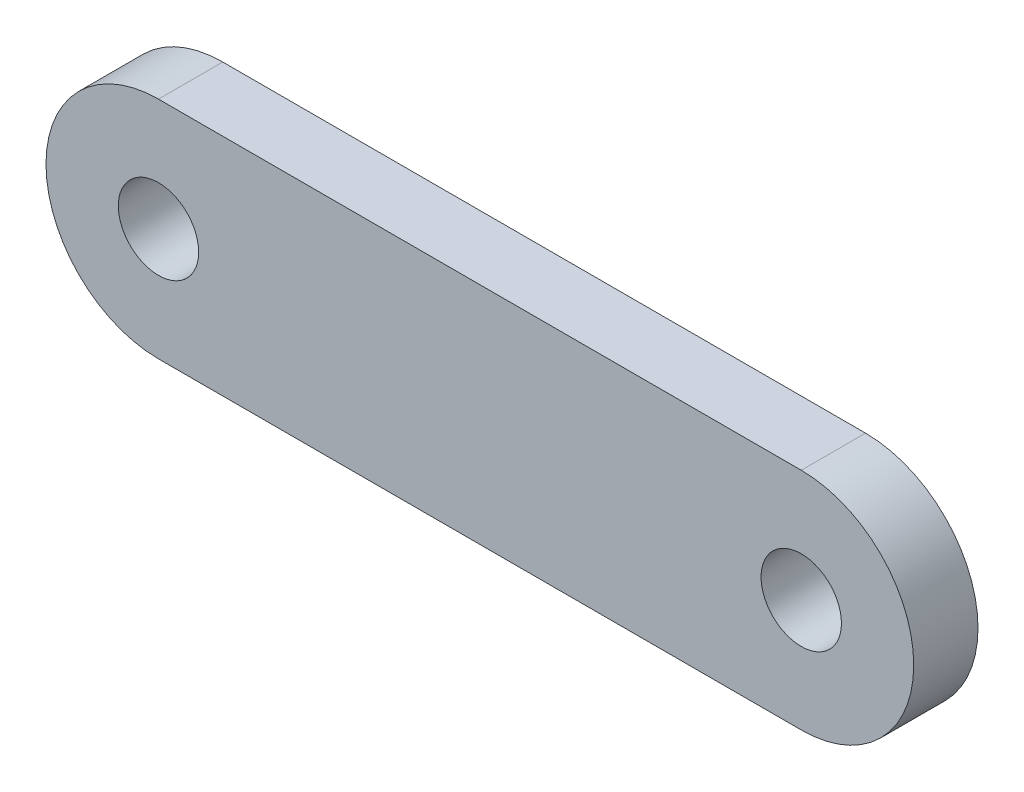
ISO-10303-21;
HEADER;
FILE_DESCRIPTION(('STEP AP214'),'2;1');
FILE_NAME('part.step','',(''),(''),'','','');
FILE_SCHEMA(('AUTOMOTIVE_DESIGN { 1 0 10303 214 1 1 1 1 }'));
ENDSEC;
DATA;
#1=APPLICATION_CONTEXT('core data for automotive mechanical design processes');
#2=APPLICATION_PROTOCOL_DEFINITION('international standard','automotive_design',2000,#1);
#3=PRODUCT_CONTEXT('',#1,'mechanical');
#4=PRODUCT('Part','Part','',(#3));
#5=PRODUCT_RELATED_PRODUCT_CATEGORY('part','',(#4));
#6=PRODUCT_DEFINITION_FORMATION('','',#4);
#7=PRODUCT_DEFINITION_CONTEXT('part definition',#1,'design');
#8=PRODUCT_DEFINITION('design','',#6,#7);
#9=PRODUCT_DEFINITION_SHAPE('','',#8);
#10=(LENGTH_UNIT() NAMED_UNIT(*) SI_UNIT(.MILLI.,.METRE.));
#11=(NAMED_UNIT(*) PLANE_ANGLE_UNIT() SI_UNIT($,.RADIAN.));
#12=(NAMED_UNIT(*) SI_UNIT($,.STERADIAN.) SOLID_ANGLE_UNIT());
#13=UNCERTAINTY_MEASURE_WITH_UNIT(LENGTH_MEASURE(1.E-05),#10,'distance_accuracy_value','');
#14=(GEOMETRIC_REPRESENTATION_CONTEXT(3) GLOBAL_UNCERTAINTY_ASSIGNED_CONTEXT((#13)) GLOBAL_UNIT_ASSIGNED_CONTEXT((#10,
#11,#12)) REPRESENTATION_CONTEXT('',''));
#15=CARTESIAN_POINT('',(0.,0.,0.));
#16=DIRECTION('',(0.,0.,1.));
#17=DIRECTION('',(1.,0.,0.));
#18=AXIS2_PLACEMENT_3D('',#15,#16,#17);
#19=CARTESIAN_POINT('',(0.,0.,4.));
#20=DIRECTION('',(0.,0.,1.));
#21=DIRECTION('',(1.,0.,0.));
#22=AXIS2_PLACEMENT_3D('',#19,#20,#21);
#23=PLANE('',#22);
#24=CARTESIAN_POINT('',(0.,0.,4.));
#25=DIRECTION('',(0.,0.,1.));
#26=DIRECTION('',(1.,0.,0.));
#27=AXIS2_PLACEMENT_3D('',#24,#25,#26);
#28=CIRCLE('',#27,2.5);
#29=CARTESIAN_POINT('',(2.5,0.,4.));
#30=VERTEX_POINT('',#29);
#31=EDGE_CURVE('E100',#30,#30,#28,.T.);
#32=ORIENTED_EDGE('',*,*,#31,.F.);
#33=EDGE_LOOP('',(#32));
#34=FACE_BOUND('',#33,.T.);
#35=CARTESIAN_POINT('',(0.,0.,4.));
#36=DIRECTION('',(0.,0.,1.));
#37=DIRECTION('',(1.,0.,0.));
#38=AXIS2_PLACEMENT_3D('',#35,#36,#37);
#39=CIRCLE('',#38,7.);
#40=CARTESIAN_POINT('',(0.,7.,4.));
#41=VERTEX_POINT('',#40);
#42=CARTESIAN_POINT('',(0.,-7.,4.));
#43=VERTEX_POINT('',#42);
#44=EDGE_CURVE('E85',#41,#43,#39,.T.);
#45=ORIENTED_EDGE('',*,*,#44,.T.);
#46=DIRECTION('',(1.,0.,0.));
#47=VECTOR('',#46,1.);
#48=CARTESIAN_POINT('',(0.,-7.,4.));
#49=LINE('',#48,#47);
#50=CARTESIAN_POINT('',(40.,-7.,4.));
#51=VERTEX_POINT('',#50);
#52=EDGE_CURVE('E80',#43,#51,#49,.T.);
#53=ORIENTED_EDGE('',*,*,#52,.T.);
#54=CARTESIAN_POINT('',(40.,0.,4.));
#55=DIRECTION('',(0.,0.,1.));
#56=DIRECTION('',(1.,0.,0.));
#57=AXIS2_PLACEMENT_3D('',#54,#55,#56);
#58=CIRCLE('',#57,7.);
#59=CARTESIAN_POINT('',(40.,7.,4.));
#60=VERTEX_POINT('',#59);
#61=EDGE_CURVE('E83',#51,#60,#58,.T.);
#62=ORIENTED_EDGE('',*,*,#61,.T.);
#63=DIRECTION('',(-1.,0.,0.));
#64=VECTOR('',#63,1.);
#65=CARTESIAN_POINT('',(0.,7.,4.));
#66=LINE('',#65,#64);
#67=EDGE_CURVE('E50',#60,#41,#66,.T.);
#68=ORIENTED_EDGE('',*,*,#67,.T.);
#69=EDGE_LOOP('',(#45,#53,#62,#68));
#70=FACE_BOUND('',#69,.T.);
#71=CARTESIAN_POINT('',(40.,0.,4.));
#72=DIRECTION('',(0.,0.,1.));
#73=DIRECTION('',(1.,0.,0.));
#74=AXIS2_PLACEMENT_3D('',#71,#72,#73);
#75=CIRCLE('',#74,2.5);
#76=CARTESIAN_POINT('',(42.5,0.,4.));
#77=VERTEX_POINT('',#76);
#78=EDGE_CURVE('E115',#77,#77,#75,.T.);
#79=ORIENTED_EDGE('',*,*,#78,.F.);
#80=EDGE_LOOP('',(#79));
#81=FACE_BOUND('',#80,.T.);
#82=ADVANCED_FACE('F33',(#34,#70,#81),#23,.T.);
#83=CARTESIAN_POINT('',(0.,0.,0.));
#84=DIRECTION('',(0.,0.,1.));
#85=DIRECTION('',(1.,0.,0.));
#86=AXIS2_PLACEMENT_3D('',#83,#84,#85);
#87=PLANE('',#86);
#88=CARTESIAN_POINT('',(0.,0.,0.));
#89=DIRECTION('',(0.,0.,1.));
#90=DIRECTION('',(1.,0.,0.));
#91=AXIS2_PLACEMENT_3D('',#88,#89,#90);
#92=CIRCLE('',#91,7.);
#93=CARTESIAN_POINT('',(0.,7.,0.));
#94=VERTEX_POINT('',#93);
#95=CARTESIAN_POINT('',(0.,-7.,0.));
#96=VERTEX_POINT('',#95);
#97=EDGE_CURVE('E97',#94,#96,#92,.T.);
#98=ORIENTED_EDGE('',*,*,#97,.F.);
#99=DIRECTION('',(-1.,0.,0.));
#100=VECTOR('',#99,1.);
#101=CARTESIAN_POINT('',(0.,7.,0.));
#102=LINE('',#101,#100);
#103=CARTESIAN_POINT('',(40.,7.,0.));
#104=VERTEX_POINT('',#103);
#105=EDGE_CURVE('E73',#104,#94,#102,.T.);
#106=ORIENTED_EDGE('',*,*,#105,.F.);
#107=CARTESIAN_POINT('',(40.,0.,0.));
#108=DIRECTION('',(0.,0.,1.));
#109=DIRECTION('',(1.,0.,0.));
#110=AXIS2_PLACEMENT_3D('',#107,#108,#109);
#111=CIRCLE('',#110,7.);
#112=CARTESIAN_POINT('',(40.,-7.,0.));
#113=VERTEX_POINT('',#112);
#114=EDGE_CURVE('E67',#113,#104,#111,.T.);
#115=ORIENTED_EDGE('',*,*,#114,.F.);
#116=DIRECTION('',(1.,0.,0.));
#117=VECTOR('',#116,1.);
#118=CARTESIAN_POINT('',(0.,-7.,0.));
#119=LINE('',#118,#117);
#120=EDGE_CURVE('E89',#96,#113,#119,.T.);
#121=ORIENTED_EDGE('',*,*,#120,.F.);
#122=EDGE_LOOP('',(#98,#106,#115,#121));
#123=FACE_BOUND('',#122,.T.);
#124=CARTESIAN_POINT('',(0.,0.,0.));
#125=DIRECTION('',(0.,0.,1.));
#126=DIRECTION('',(1.,0.,0.));
#127=AXIS2_PLACEMENT_3D('',#124,#125,#126);
#128=CIRCLE('',#127,2.5);
#129=CARTESIAN_POINT('',(2.5,0.,0.));
#130=VERTEX_POINT('',#129);
#131=EDGE_CURVE('E112',#130,#130,#128,.T.);
#132=ORIENTED_EDGE('',*,*,#131,.T.);
#133=EDGE_LOOP('',(#132));
#134=FACE_BOUND('',#133,.T.);
#135=CARTESIAN_POINT('',(40.,0.,0.));
#136=DIRECTION('',(0.,0.,1.));
#137=DIRECTION('',(1.,0.,0.));
#138=AXIS2_PLACEMENT_3D('',#135,#136,#137);
#139=CIRCLE('',#138,2.5);
#140=CARTESIAN_POINT('',(42.5,0.,0.));
#141=VERTEX_POINT('',#140);
#142=EDGE_CURVE('E118',#141,#141,#139,.T.);
#143=ORIENTED_EDGE('',*,*,#142,.T.);
#144=EDGE_LOOP('',(#143));
#145=FACE_BOUND('',#144,.T.);
#146=ADVANCED_FACE('F108',(#123,#134,#145),#87,.F.);
#147=CARTESIAN_POINT('',(0.,0.,4.));
#148=DIRECTION('',(0.,0.,-1.));
#149=DIRECTION('',(-1.,0.,0.));
#150=AXIS2_PLACEMENT_3D('',#147,#148,#149);
#151=CYLINDRICAL_SURFACE('',#150,7.);
#152=ORIENTED_EDGE('',*,*,#97,.T.);
#153=DIRECTION('',(0.,0.,-1.));
#154=VECTOR('',#153,1.);
#155=CARTESIAN_POINT('',(0.,-7.,4.));
#156=LINE('',#155,#154);
#157=EDGE_CURVE('E11',#43,#96,#156,.T.);
#158=ORIENTED_EDGE('',*,*,#157,.F.);
#159=ORIENTED_EDGE('',*,*,#44,.F.);
#160=DIRECTION('',(0.,0.,-1.));
#161=VECTOR('',#160,1.);
#162=CARTESIAN_POINT('',(0.,7.,4.));
#163=LINE('',#162,#161);
#164=EDGE_CURVE('E93',#41,#94,#163,.T.);
#165=ORIENTED_EDGE('',*,*,#164,.T.);
#166=EDGE_LOOP('',(#152,#158,#159,#165));
#167=FACE_BOUND('',#166,.T.);
#168=ADVANCED_FACE('F35',(#167),#151,.T.);
#169=CARTESIAN_POINT('',(0.,-7.,4.));
#170=DIRECTION('',(0.,1.,0.));
#171=DIRECTION('',(0.,0.,1.));
#172=AXIS2_PLACEMENT_3D('',#169,#170,#171);
#173=PLANE('',#172);
#174=ORIENTED_EDGE('',*,*,#120,.T.);
#175=DIRECTION('',(0.,0.,-1.));
#176=VECTOR('',#175,1.);
#177=CARTESIAN_POINT('',(40.,-7.,4.));
#178=LINE('',#177,#176);
#179=EDGE_CURVE('E42',#51,#113,#178,.T.);
#180=ORIENTED_EDGE('',*,*,#179,.F.);
#181=ORIENTED_EDGE('',*,*,#52,.F.);
#182=ORIENTED_EDGE('',*,*,#157,.T.);
#183=EDGE_LOOP('',(#174,#180,#181,#182));
#184=FACE_BOUND('',#183,.T.);
#185=ADVANCED_FACE('F88',(#184),#173,.F.);
#186=CARTESIAN_POINT('',(40.,0.,4.));
#187=DIRECTION('',(0.,0.,-1.));
#188=DIRECTION('',(-1.,0.,0.));
#189=AXIS2_PLACEMENT_3D('',#186,#187,#188);
#190=CYLINDRICAL_SURFACE('',#189,7.);
#191=ORIENTED_EDGE('',*,*,#114,.T.);
#192=DIRECTION('',(0.,0.,-1.));
#193=VECTOR('',#192,1.);
#194=CARTESIAN_POINT('',(40.,7.,4.));
#195=LINE('',#194,#193);
#196=EDGE_CURVE('E90',#60,#104,#195,.T.);
#197=ORIENTED_EDGE('',*,*,#196,.F.);
#198=ORIENTED_EDGE('',*,*,#61,.F.);
#199=ORIENTED_EDGE('',*,*,#179,.T.);
#200=EDGE_LOOP('',(#191,#197,#198,#199));
#201=FACE_BOUND('',#200,.T.);
#202=ADVANCED_FACE('F91',(#201),#190,.T.);
#203=CARTESIAN_POINT('',(0.,7.,4.));
#204=DIRECTION('',(0.,-1.,0.));
#205=DIRECTION('',(0.,0.,-1.));
#206=AXIS2_PLACEMENT_3D('',#203,#204,#205);
#207=PLANE('',#206);
#208=ORIENTED_EDGE('',*,*,#105,.T.);
#209=ORIENTED_EDGE('',*,*,#164,.F.);
#210=ORIENTED_EDGE('',*,*,#67,.F.);
#211=ORIENTED_EDGE('',*,*,#196,.T.);
#212=EDGE_LOOP('',(#208,#209,#210,#211));
#213=FACE_BOUND('',#212,.T.);
#214=ADVANCED_FACE('F105',(#213),#207,.F.);
#215=CARTESIAN_POINT('',(0.,0.,4.));
#216=DIRECTION('',(0.,0.,-1.));
#217=DIRECTION('',(-1.,0.,0.));
#218=AXIS2_PLACEMENT_3D('',#215,#216,#217);
#219=CYLINDRICAL_SURFACE('',#218,2.5);
#220=ORIENTED_EDGE('',*,*,#31,.T.);
#221=EDGE_LOOP('',(#220));
#222=FACE_BOUND('',#221,.T.);
#223=ORIENTED_EDGE('',*,*,#131,.F.);
#224=EDGE_LOOP('',(#223));
#225=FACE_BOUND('',#224,.T.);
#226=ADVANCED_FACE('F135',(#222,#225),#219,.F.);
#227=CARTESIAN_POINT('',(40.,0.,4.));
#228=DIRECTION('',(0.,0.,-1.));
#229=DIRECTION('',(-1.,0.,0.));
#230=AXIS2_PLACEMENT_3D('',#227,#228,#229);
#231=CYLINDRICAL_SURFACE('',#230,2.5);
#232=ORIENTED_EDGE('',*,*,#78,.T.);
#233=EDGE_LOOP('',(#232));
#234=FACE_BOUND('',#233,.T.);
#235=ORIENTED_EDGE('',*,*,#142,.F.);
#236=EDGE_LOOP('',(#235));
#237=FACE_BOUND('',#236,.T.);
#238=ADVANCED_FACE('F124',(#234,#237),#231,.F.);
#239=CLOSED_SHELL('',(#82,#146,#168,#185,#202,#214,#226,#238));
#240=MANIFOLD_SOLID_BREP('B2',#239);
#241=ADVANCED_BREP_SHAPE_REPRESENTATION('',(#18,#240),#14);
#242=SHAPE_DEFINITION_REPRESENTATION(#9,#241);
ENDSEC;
END-ISO-10303-21;
